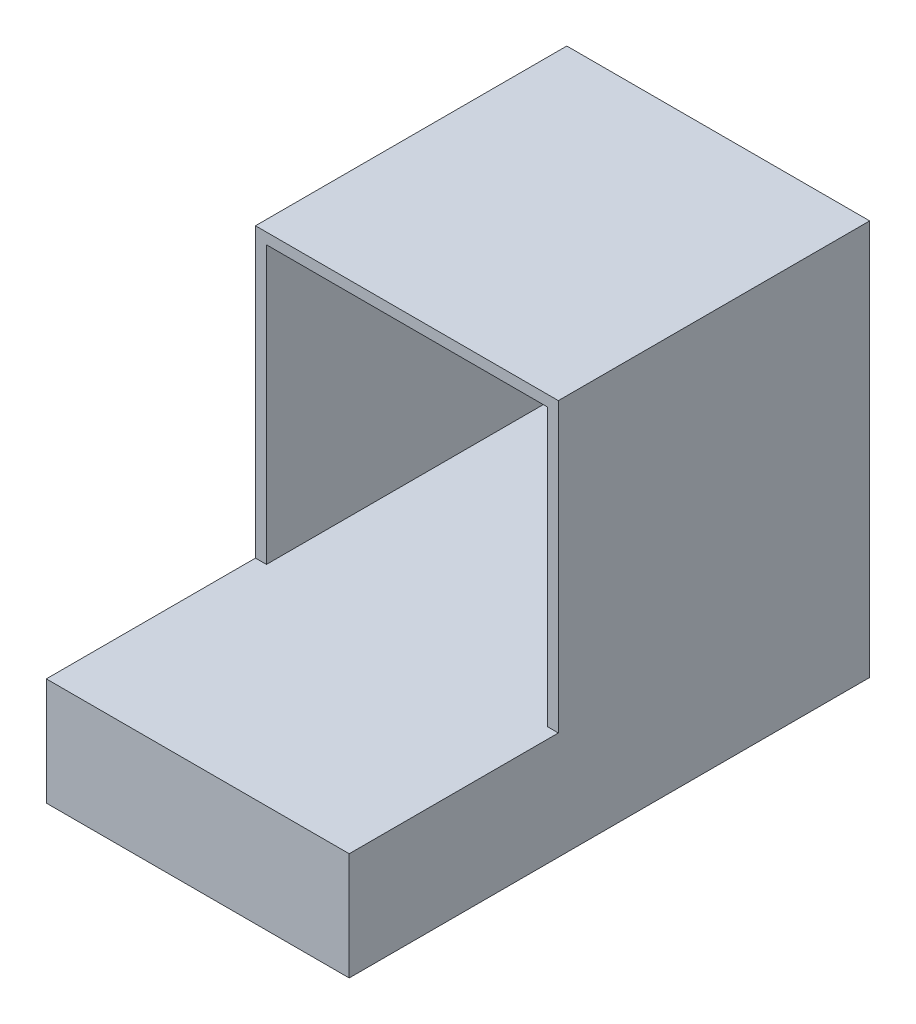
ISO-10303-21;
HEADER;
FILE_DESCRIPTION(('STEP AP214'),'2;1');
FILE_NAME('part.step','',(''),(''),'','','');
FILE_SCHEMA(('AUTOMOTIVE_DESIGN { 1 0 10303 214 1 1 1 1 }'));
ENDSEC;
DATA;
#1=APPLICATION_CONTEXT('core data for automotive mechanical design processes');
#2=APPLICATION_PROTOCOL_DEFINITION('international standard','automotive_design',2000,#1);
#3=PRODUCT_CONTEXT('',#1,'mechanical');
#4=PRODUCT('Part','Part','',(#3));
#5=PRODUCT_RELATED_PRODUCT_CATEGORY('part','',(#4));
#6=PRODUCT_DEFINITION_FORMATION('','',#4);
#7=PRODUCT_DEFINITION_CONTEXT('part definition',#1,'design');
#8=PRODUCT_DEFINITION('design','',#6,#7);
#9=PRODUCT_DEFINITION_SHAPE('','',#8);
#10=(LENGTH_UNIT() NAMED_UNIT(*) SI_UNIT(.MILLI.,.METRE.));
#11=(NAMED_UNIT(*) PLANE_ANGLE_UNIT() SI_UNIT($,.RADIAN.));
#12=(NAMED_UNIT(*) SI_UNIT($,.STERADIAN.) SOLID_ANGLE_UNIT());
#13=UNCERTAINTY_MEASURE_WITH_UNIT(LENGTH_MEASURE(1.E-05),#10,'distance_accuracy_value','');
#14=(GEOMETRIC_REPRESENTATION_CONTEXT(3) GLOBAL_UNCERTAINTY_ASSIGNED_CONTEXT((#13)) GLOBAL_UNIT_ASSIGNED_CONTEXT((#10,
#11,#12)) REPRESENTATION_CONTEXT('',''));
#15=CARTESIAN_POINT('',(0.,0.,0.));
#16=DIRECTION('',(0.,0.,1.));
#17=DIRECTION('',(1.,0.,0.));
#18=AXIS2_PLACEMENT_3D('',#15,#16,#17);
#19=CARTESIAN_POINT('',(4.7625,0.,134.9756));
#20=DIRECTION('',(1.,0.,0.));
#21=DIRECTION('',(0.,1.,0.));
#22=AXIS2_PLACEMENT_3D('',#19,#20,#21);
#23=PLANE('',#22);
#24=DIRECTION('',(0.,-1.,0.));
#25=VECTOR('',#24,1.);
#26=CARTESIAN_POINT('',(4.7625,0.,0.));
#27=LINE('',#26,#25);
#28=CARTESIAN_POINT('',(4.76250000000001,41.8973,0.));
#29=VERTEX_POINT('',#28);
#30=CARTESIAN_POINT('',(4.7625,4.7625,0.));
#31=VERTEX_POINT('',#30);
#32=EDGE_CURVE('E172',#29,#31,#27,.T.);
#33=ORIENTED_EDGE('',*,*,#32,.F.);
#34=DIRECTION('',(0.,0.,-1.));
#35=VECTOR('',#34,1.);
#36=CARTESIAN_POINT('',(4.76250000000001,41.8973,134.9756));
#37=LINE('',#36,#35);
#38=CARTESIAN_POINT('',(4.76250000000001,41.8973,220.8911));
#39=VERTEX_POINT('',#38);
#40=EDGE_CURVE('E48',#39,#29,#37,.T.);
#41=ORIENTED_EDGE('',*,*,#40,.F.);
#42=DIRECTION('',(0.,-1.,0.));
#43=VECTOR('',#42,1.);
#44=CARTESIAN_POINT('',(4.7625,0.,220.8911));
#45=LINE('',#44,#43);
#46=CARTESIAN_POINT('',(4.7625,4.7625,220.8911));
#47=VERTEX_POINT('',#46);
#48=EDGE_CURVE('E154',#39,#47,#45,.T.);
#49=ORIENTED_EDGE('',*,*,#48,.T.);
#50=DIRECTION('',(0.,0.,-1.));
#51=VECTOR('',#50,1.);
#52=CARTESIAN_POINT('',(4.7625,4.7625,134.9756));
#53=LINE('',#52,#51);
#54=EDGE_CURVE('E137',#47,#31,#53,.T.);
#55=ORIENTED_EDGE('',*,*,#54,.T.);
#56=EDGE_LOOP('',(#33,#41,#49,#55));
#57=FACE_BOUND('',#56,.T.);
#58=ADVANCED_FACE('F33',(#57),#23,.T.);
#59=CARTESIAN_POINT('',(126.5555,0.,134.9756));
#60=DIRECTION('',(-1.,0.,0.));
#61=DIRECTION('',(0.,0.,1.));
#62=AXIS2_PLACEMENT_3D('',#59,#60,#61);
#63=PLANE('',#62);
#64=DIRECTION('',(0.,0.,-1.));
#65=VECTOR('',#64,1.);
#66=CARTESIAN_POINT('',(126.5555,41.8973,225.6536));
#67=LINE('',#66,#65);
#68=CARTESIAN_POINT('',(126.5555,41.8973,220.8911));
#69=VERTEX_POINT('',#68);
#70=CARTESIAN_POINT('',(126.5555,41.8973,0.));
#71=VERTEX_POINT('',#70);
#72=EDGE_CURVE('E162',#69,#71,#67,.T.);
#73=ORIENTED_EDGE('',*,*,#72,.T.);
#74=DIRECTION('',(0.,1.,0.));
#75=VECTOR('',#74,1.);
#76=CARTESIAN_POINT('',(126.5555,0.,0.));
#77=LINE('',#76,#75);
#78=CARTESIAN_POINT('',(126.5555,4.7625,0.));
#79=VERTEX_POINT('',#78);
#80=EDGE_CURVE('E181',#79,#71,#77,.T.);
#81=ORIENTED_EDGE('',*,*,#80,.F.);
#82=DIRECTION('',(0.,0.,-1.));
#83=VECTOR('',#82,1.);
#84=CARTESIAN_POINT('',(126.5555,4.7625,134.9756));
#85=LINE('',#84,#83);
#86=CARTESIAN_POINT('',(126.5555,4.7625,220.8911));
#87=VERTEX_POINT('',#86);
#88=EDGE_CURVE('E148',#87,#79,#85,.T.);
#89=ORIENTED_EDGE('',*,*,#88,.F.);
#90=DIRECTION('',(0.,1.,0.));
#91=VECTOR('',#90,1.);
#92=CARTESIAN_POINT('',(126.5555,0.,220.8911));
#93=LINE('',#92,#91);
#94=EDGE_CURVE('E155',#87,#69,#93,.T.);
#95=ORIENTED_EDGE('',*,*,#94,.T.);
#96=EDGE_LOOP('',(#73,#81,#89,#95));
#97=FACE_BOUND('',#96,.T.);
#98=ADVANCED_FACE('F277',(#97),#63,.T.);
#99=CARTESIAN_POINT('',(0.,0.,134.9756));
#100=DIRECTION('',(0.,0.,-1.));
#101=DIRECTION('',(-1.,0.,0.));
#102=AXIS2_PLACEMENT_3D('',#99,#100,#101);
#103=PLANE('',#102);
#104=DIRECTION('',(0.,1.,0.));
#105=VECTOR('',#104,1.);
#106=CARTESIAN_POINT('',(126.5555,0.,134.9756));
#107=LINE('',#106,#105);
#108=CARTESIAN_POINT('',(126.5555,46.6598,134.9756));
#109=VERTEX_POINT('',#108);
#110=CARTESIAN_POINT('',(126.5555,166.6875,134.9756));
#111=VERTEX_POINT('',#110);
#112=EDGE_CURVE('E41',#109,#111,#107,.T.);
#113=ORIENTED_EDGE('',*,*,#112,.F.);
#114=DIRECTION('',(-1.,0.,0.));
#115=VECTOR('',#114,1.);
#116=CARTESIAN_POINT('',(0.,46.6598,134.9756));
#117=LINE('',#116,#115);
#118=CARTESIAN_POINT('',(131.318,46.6598,134.9756));
#119=VERTEX_POINT('',#118);
#120=EDGE_CURVE('E195',#119,#109,#117,.T.);
#121=ORIENTED_EDGE('',*,*,#120,.F.);
#122=DIRECTION('',(0.,1.,0.));
#123=VECTOR('',#122,1.);
#124=CARTESIAN_POINT('',(131.318,0.,134.9756));
#125=LINE('',#124,#123);
#126=CARTESIAN_POINT('',(131.318,171.45,134.9756));
#127=VERTEX_POINT('',#126);
#128=EDGE_CURVE('E214',#119,#127,#125,.T.);
#129=ORIENTED_EDGE('',*,*,#128,.T.);
#130=DIRECTION('',(-1.,0.,0.));
#131=VECTOR('',#130,1.);
#132=CARTESIAN_POINT('',(0.,171.45,134.9756));
#133=LINE('',#132,#131);
#134=CARTESIAN_POINT('',(0.,171.45,134.9756));
#135=VERTEX_POINT('',#134);
#136=EDGE_CURVE('E217',#127,#135,#133,.T.);
#137=ORIENTED_EDGE('',*,*,#136,.T.);
#138=DIRECTION('',(0.,-1.,0.));
#139=VECTOR('',#138,1.);
#140=CARTESIAN_POINT('',(0.,0.,134.9756));
#141=LINE('',#140,#139);
#142=CARTESIAN_POINT('',(0.,46.6598,134.9756));
#143=VERTEX_POINT('',#142);
#144=EDGE_CURVE('E211',#135,#143,#141,.T.);
#145=ORIENTED_EDGE('',*,*,#144,.T.);
#146=CARTESIAN_POINT('',(4.76250000000001,46.6598,134.9756));
#147=VERTEX_POINT('',#146);
#148=EDGE_CURVE('E147',#147,#143,#117,.T.);
#149=ORIENTED_EDGE('',*,*,#148,.F.);
#150=DIRECTION('',(0.,-1.,0.));
#151=VECTOR('',#150,1.);
#152=CARTESIAN_POINT('',(4.7625,0.,134.9756));
#153=LINE('',#152,#151);
#154=CARTESIAN_POINT('',(4.76250000000003,166.6875,134.9756));
#155=VERTEX_POINT('',#154);
#156=EDGE_CURVE('E180',#155,#147,#153,.T.);
#157=ORIENTED_EDGE('',*,*,#156,.F.);
#158=DIRECTION('',(-1.,0.,0.));
#159=VECTOR('',#158,1.);
#160=CARTESIAN_POINT('',(0.,166.6875,134.9756));
#161=LINE('',#160,#159);
#162=EDGE_CURVE('E167',#111,#155,#161,.T.);
#163=ORIENTED_EDGE('',*,*,#162,.F.);
#164=EDGE_LOOP('',(#113,#121,#129,#137,#145,#149,#157,#163));
#165=FACE_BOUND('',#164,.T.);
#166=ADVANCED_FACE('F257',(#165),#103,.F.);
#167=CARTESIAN_POINT('',(0.,0.,0.));
#168=DIRECTION('',(0.,0.,-1.));
#169=DIRECTION('',(-1.,0.,0.));
#170=AXIS2_PLACEMENT_3D('',#167,#168,#169);
#171=PLANE('',#170);
#172=DIRECTION('',(-1.,0.,0.));
#173=VECTOR('',#172,1.);
#174=CARTESIAN_POINT('',(131.318,41.8973,0.));
#175=LINE('',#174,#173);
#176=EDGE_CURVE('E158',#71,#29,#175,.T.);
#177=ORIENTED_EDGE('',*,*,#176,.T.);
#178=ORIENTED_EDGE('',*,*,#32,.T.);
#179=DIRECTION('',(1.,0.,0.));
#180=VECTOR('',#179,1.);
#181=CARTESIAN_POINT('',(0.,4.7625,0.));
#182=LINE('',#181,#180);
#183=EDGE_CURVE('E144',#31,#79,#182,.T.);
#184=ORIENTED_EDGE('',*,*,#183,.T.);
#185=ORIENTED_EDGE('',*,*,#80,.T.);
#186=EDGE_LOOP('',(#177,#178,#184,#185));
#187=FACE_BOUND('',#186,.T.);
#188=CARTESIAN_POINT('',(4.76250000000003,166.6875,0.));
#189=VERTEX_POINT('',#188);
#190=CARTESIAN_POINT('',(4.76250000000001,46.6598,0.));
#191=VERTEX_POINT('',#190);
#192=EDGE_CURVE('E175',#189,#191,#27,.T.);
#193=ORIENTED_EDGE('',*,*,#192,.T.);
#194=DIRECTION('',(-1.,0.,0.));
#195=VECTOR('',#194,1.);
#196=CARTESIAN_POINT('',(131.318,46.6598,0.));
#197=LINE('',#196,#195);
#198=CARTESIAN_POINT('',(126.5555,46.6598,0.));
#199=VERTEX_POINT('',#198);
#200=EDGE_CURVE('E436',#199,#191,#197,.T.);
#201=ORIENTED_EDGE('',*,*,#200,.F.);
#202=CARTESIAN_POINT('',(126.5555,166.6875,0.));
#203=VERTEX_POINT('',#202);
#204=EDGE_CURVE('E184',#199,#203,#77,.T.);
#205=ORIENTED_EDGE('',*,*,#204,.T.);
#206=DIRECTION('',(-1.,0.,0.));
#207=VECTOR('',#206,1.);
#208=CARTESIAN_POINT('',(0.,166.6875,0.));
#209=LINE('',#208,#207);
#210=EDGE_CURVE('E177',#203,#189,#209,.T.);
#211=ORIENTED_EDGE('',*,*,#210,.T.);
#212=EDGE_LOOP('',(#193,#201,#205,#211));
#213=FACE_BOUND('',#212,.T.);
#214=DIRECTION('',(1.,0.,0.));
#215=VECTOR('',#214,1.);
#216=CARTESIAN_POINT('',(0.,0.,0.));
#217=LINE('',#216,#215);
#218=CARTESIAN_POINT('',(0.,0.,0.));
#219=VERTEX_POINT('',#218);
#220=CARTESIAN_POINT('',(131.318,0.,0.));
#221=VERTEX_POINT('',#220);
#222=EDGE_CURVE('E221',#219,#221,#217,.T.);
#223=ORIENTED_EDGE('',*,*,#222,.F.);
#224=DIRECTION('',(0.,-1.,0.));
#225=VECTOR('',#224,1.);
#226=CARTESIAN_POINT('',(0.,0.,0.));
#227=LINE('',#226,#225);
#228=CARTESIAN_POINT('',(0.,171.45,0.));
#229=VERTEX_POINT('',#228);
#230=EDGE_CURVE('E210',#229,#219,#227,.T.);
#231=ORIENTED_EDGE('',*,*,#230,.F.);
#232=DIRECTION('',(-1.,0.,0.));
#233=VECTOR('',#232,1.);
#234=CARTESIAN_POINT('',(0.,171.45,0.));
#235=LINE('',#234,#233);
#236=CARTESIAN_POINT('',(131.318,171.45,0.));
#237=VERTEX_POINT('',#236);
#238=EDGE_CURVE('E215',#237,#229,#235,.T.);
#239=ORIENTED_EDGE('',*,*,#238,.F.);
#240=DIRECTION('',(0.,1.,0.));
#241=VECTOR('',#240,1.);
#242=CARTESIAN_POINT('',(131.318,0.,0.));
#243=LINE('',#242,#241);
#244=EDGE_CURVE('E223',#221,#237,#243,.T.);
#245=ORIENTED_EDGE('',*,*,#244,.F.);
#246=EDGE_LOOP('',(#223,#231,#239,#245));
#247=FACE_BOUND('',#246,.T.);
#248=ADVANCED_FACE('F246',(#187,#213,#247),#171,.T.);
#249=CARTESIAN_POINT('',(0.,0.,134.9756));
#250=DIRECTION('',(1.,0.,0.));
#251=DIRECTION('',(0.,1.,0.));
#252=AXIS2_PLACEMENT_3D('',#249,#250,#251);
#253=PLANE('',#252);
#254=ORIENTED_EDGE('',*,*,#230,.T.);
#255=DIRECTION('',(0.,0.,-1.));
#256=VECTOR('',#255,1.);
#257=CARTESIAN_POINT('',(0.,0.,134.9756));
#258=LINE('',#257,#256);
#259=CARTESIAN_POINT('',(0.,0.,225.6536));
#260=VERTEX_POINT('',#259);
#261=EDGE_CURVE('E188',#260,#219,#258,.T.);
#262=ORIENTED_EDGE('',*,*,#261,.F.);
#263=DIRECTION('',(0.,-1.,0.));
#264=VECTOR('',#263,1.);
#265=CARTESIAN_POINT('',(0.,0.,225.6536));
#266=LINE('',#265,#264);
#267=CARTESIAN_POINT('',(0.,46.6598,225.6536));
#268=VERTEX_POINT('',#267);
#269=EDGE_CURVE('E191',#268,#260,#266,.T.);
#270=ORIENTED_EDGE('',*,*,#269,.F.);
#271=DIRECTION('',(0.,0.,-1.));
#272=VECTOR('',#271,1.);
#273=CARTESIAN_POINT('',(0.,46.6598,225.6536));
#274=LINE('',#273,#272);
#275=EDGE_CURVE('E202',#268,#143,#274,.T.);
#276=ORIENTED_EDGE('',*,*,#275,.T.);
#277=ORIENTED_EDGE('',*,*,#144,.F.);
#278=DIRECTION('',(0.,0.,-1.));
#279=VECTOR('',#278,1.);
#280=CARTESIAN_POINT('',(0.,171.45,134.9756));
#281=LINE('',#280,#279);
#282=EDGE_CURVE('E219',#135,#229,#281,.T.);
#283=ORIENTED_EDGE('',*,*,#282,.T.);
#284=EDGE_LOOP('',(#254,#262,#270,#276,#277,#283));
#285=FACE_BOUND('',#284,.T.);
#286=ADVANCED_FACE('F35',(#285),#253,.F.);
#287=CARTESIAN_POINT('',(0.,0.,134.9756));
#288=DIRECTION('',(0.,1.,0.));
#289=DIRECTION('',(0.,0.,1.));
#290=AXIS2_PLACEMENT_3D('',#287,#288,#289);
#291=PLANE('',#290);
#292=ORIENTED_EDGE('',*,*,#222,.T.);
#293=DIRECTION('',(0.,0.,-1.));
#294=VECTOR('',#293,1.);
#295=CARTESIAN_POINT('',(131.318,0.,134.9756));
#296=LINE('',#295,#294);
#297=CARTESIAN_POINT('',(131.318,0.,225.6536));
#298=VERTEX_POINT('',#297);
#299=EDGE_CURVE('E231',#298,#221,#296,.T.);
#300=ORIENTED_EDGE('',*,*,#299,.F.);
#301=DIRECTION('',(1.,0.,0.));
#302=VECTOR('',#301,1.);
#303=CARTESIAN_POINT('',(0.,0.,225.6536));
#304=LINE('',#303,#302);
#305=EDGE_CURVE('E194',#260,#298,#304,.T.);
#306=ORIENTED_EDGE('',*,*,#305,.F.);
#307=ORIENTED_EDGE('',*,*,#261,.T.);
#308=EDGE_LOOP('',(#292,#300,#306,#307));
#309=FACE_BOUND('',#308,.T.);
#310=ADVANCED_FACE('F236',(#309),#291,.F.);
#311=CARTESIAN_POINT('',(131.318,0.,134.9756));
#312=DIRECTION('',(-1.,0.,0.));
#313=DIRECTION('',(0.,0.,1.));
#314=AXIS2_PLACEMENT_3D('',#311,#312,#313);
#315=PLANE('',#314);
#316=ORIENTED_EDGE('',*,*,#128,.F.);
#317=DIRECTION('',(0.,0.,-1.));
#318=VECTOR('',#317,1.);
#319=CARTESIAN_POINT('',(131.318,46.6598,225.6536));
#320=LINE('',#319,#318);
#321=CARTESIAN_POINT('',(131.318,46.6598,225.6536));
#322=VERTEX_POINT('',#321);
#323=EDGE_CURVE('E207',#322,#119,#320,.T.);
#324=ORIENTED_EDGE('',*,*,#323,.F.);
#325=DIRECTION('',(0.,1.,0.));
#326=VECTOR('',#325,1.);
#327=CARTESIAN_POINT('',(131.318,0.,225.6536));
#328=LINE('',#327,#326);
#329=EDGE_CURVE('E198',#298,#322,#328,.T.);
#330=ORIENTED_EDGE('',*,*,#329,.F.);
#331=ORIENTED_EDGE('',*,*,#299,.T.);
#332=ORIENTED_EDGE('',*,*,#244,.T.);
#333=DIRECTION('',(0.,0.,-1.));
#334=VECTOR('',#333,1.);
#335=CARTESIAN_POINT('',(131.318,171.45,134.9756));
#336=LINE('',#335,#334);
#337=EDGE_CURVE('E228',#127,#237,#336,.T.);
#338=ORIENTED_EDGE('',*,*,#337,.F.);
#339=EDGE_LOOP('',(#316,#324,#330,#331,#332,#338));
#340=FACE_BOUND('',#339,.T.);
#341=ADVANCED_FACE('F250',(#340),#315,.F.);
#342=CARTESIAN_POINT('',(0.,171.45,134.9756));
#343=DIRECTION('',(0.,-1.,0.));
#344=DIRECTION('',(0.,0.,-1.));
#345=AXIS2_PLACEMENT_3D('',#342,#343,#344);
#346=PLANE('',#345);
#347=ORIENTED_EDGE('',*,*,#238,.T.);
#348=ORIENTED_EDGE('',*,*,#282,.F.);
#349=ORIENTED_EDGE('',*,*,#136,.F.);
#350=ORIENTED_EDGE('',*,*,#337,.T.);
#351=EDGE_LOOP('',(#347,#348,#349,#350));
#352=FACE_BOUND('',#351,.T.);
#353=ADVANCED_FACE('F254',(#352),#346,.F.);
#354=CARTESIAN_POINT('',(0.,46.6598,225.6536));
#355=DIRECTION('',(0.,-1.,0.));
#356=DIRECTION('',(0.,0.,-1.));
#357=AXIS2_PLACEMENT_3D('',#354,#355,#356);
#358=PLANE('',#357);
#359=ORIENTED_EDGE('',*,*,#120,.T.);
#360=DIRECTION('',(0.,0.,-1.));
#361=VECTOR('',#360,1.);
#362=CARTESIAN_POINT('',(126.5555,46.6598,134.9756));
#363=LINE('',#362,#361);
#364=EDGE_CURVE('E11',#109,#199,#363,.T.);
#365=ORIENTED_EDGE('',*,*,#364,.T.);
#366=ORIENTED_EDGE('',*,*,#200,.T.);
#367=DIRECTION('',(0.,0.,1.));
#368=VECTOR('',#367,1.);
#369=CARTESIAN_POINT('',(4.76250000000001,46.6598,134.9756));
#370=LINE('',#369,#368);
#371=EDGE_CURVE('E56',#191,#147,#370,.T.);
#372=ORIENTED_EDGE('',*,*,#371,.T.);
#373=ORIENTED_EDGE('',*,*,#148,.T.);
#374=ORIENTED_EDGE('',*,*,#275,.F.);
#375=DIRECTION('',(-1.,0.,0.));
#376=VECTOR('',#375,1.);
#377=CARTESIAN_POINT('',(0.,46.6598,225.6536));
#378=LINE('',#377,#376);
#379=EDGE_CURVE('E200',#322,#268,#378,.T.);
#380=ORIENTED_EDGE('',*,*,#379,.F.);
#381=ORIENTED_EDGE('',*,*,#323,.T.);
#382=EDGE_LOOP('',(#359,#365,#366,#372,#373,#374,#380,#381));
#383=FACE_BOUND('',#382,.T.);
#384=ADVANCED_FACE('F262',(#383),#358,.F.);
#385=CARTESIAN_POINT('',(0.,0.,225.6536));
#386=DIRECTION('',(0.,0.,-1.));
#387=DIRECTION('',(-1.,0.,0.));
#388=AXIS2_PLACEMENT_3D('',#385,#386,#387);
#389=PLANE('',#388);
#390=ORIENTED_EDGE('',*,*,#269,.T.);
#391=ORIENTED_EDGE('',*,*,#305,.T.);
#392=ORIENTED_EDGE('',*,*,#329,.T.);
#393=ORIENTED_EDGE('',*,*,#379,.T.);
#394=EDGE_LOOP('',(#390,#391,#392,#393));
#395=FACE_BOUND('',#394,.T.);
#396=ADVANCED_FACE('F265',(#395),#389,.F.);
#397=ORIENTED_EDGE('',*,*,#371,.F.);
#398=ORIENTED_EDGE('',*,*,#192,.F.);
#399=DIRECTION('',(0.,0.,-1.));
#400=VECTOR('',#399,1.);
#401=CARTESIAN_POINT('',(4.76250000000003,166.6875,134.9756));
#402=LINE('',#401,#400);
#403=EDGE_CURVE('E164',#155,#189,#402,.T.);
#404=ORIENTED_EDGE('',*,*,#403,.F.);
#405=ORIENTED_EDGE('',*,*,#156,.T.);
#406=EDGE_LOOP('',(#397,#398,#404,#405));
#407=FACE_BOUND('',#406,.T.);
#408=ADVANCED_FACE('F267',(#407),#23,.T.);
#409=CARTESIAN_POINT('',(0.,4.7625,134.9756));
#410=DIRECTION('',(0.,1.,0.));
#411=DIRECTION('',(0.,0.,1.));
#412=AXIS2_PLACEMENT_3D('',#409,#410,#411);
#413=PLANE('',#412);
#414=ORIENTED_EDGE('',*,*,#183,.F.);
#415=ORIENTED_EDGE('',*,*,#54,.F.);
#416=DIRECTION('',(1.,0.,0.));
#417=VECTOR('',#416,1.);
#418=CARTESIAN_POINT('',(0.,4.7625,220.8911));
#419=LINE('',#418,#417);
#420=EDGE_CURVE('E141',#47,#87,#419,.T.);
#421=ORIENTED_EDGE('',*,*,#420,.T.);
#422=ORIENTED_EDGE('',*,*,#88,.T.);
#423=EDGE_LOOP('',(#414,#415,#421,#422));
#424=FACE_BOUND('',#423,.T.);
#425=ADVANCED_FACE('F139',(#424),#413,.T.);
#426=ORIENTED_EDGE('',*,*,#364,.F.);
#427=ORIENTED_EDGE('',*,*,#112,.T.);
#428=DIRECTION('',(0.,0.,-1.));
#429=VECTOR('',#428,1.);
#430=CARTESIAN_POINT('',(126.5555,166.6875,134.9756));
#431=LINE('',#430,#429);
#432=EDGE_CURVE('E166',#111,#203,#431,.T.);
#433=ORIENTED_EDGE('',*,*,#432,.T.);
#434=ORIENTED_EDGE('',*,*,#204,.F.);
#435=EDGE_LOOP('',(#426,#427,#433,#434));
#436=FACE_BOUND('',#435,.T.);
#437=ADVANCED_FACE('F283',(#436),#63,.T.);
#438=CARTESIAN_POINT('',(0.,166.6875,134.9756));
#439=DIRECTION('',(0.,-1.,0.));
#440=DIRECTION('',(0.,0.,-1.));
#441=AXIS2_PLACEMENT_3D('',#438,#439,#440);
#442=PLANE('',#441);
#443=ORIENTED_EDGE('',*,*,#210,.F.);
#444=ORIENTED_EDGE('',*,*,#432,.F.);
#445=ORIENTED_EDGE('',*,*,#162,.T.);
#446=ORIENTED_EDGE('',*,*,#403,.T.);
#447=EDGE_LOOP('',(#443,#444,#445,#446));
#448=FACE_BOUND('',#447,.T.);
#449=ADVANCED_FACE('F288',(#448),#442,.T.);
#450=CARTESIAN_POINT('',(0.,41.8973,225.6536));
#451=DIRECTION('',(0.,-1.,0.));
#452=DIRECTION('',(0.,0.,-1.));
#453=AXIS2_PLACEMENT_3D('',#450,#451,#452);
#454=PLANE('',#453);
#455=ORIENTED_EDGE('',*,*,#40,.T.);
#456=ORIENTED_EDGE('',*,*,#176,.F.);
#457=ORIENTED_EDGE('',*,*,#72,.F.);
#458=DIRECTION('',(-1.,0.,0.));
#459=VECTOR('',#458,1.);
#460=CARTESIAN_POINT('',(0.,41.8973,220.8911));
#461=LINE('',#460,#459);
#462=EDGE_CURVE('E163',#69,#39,#461,.T.);
#463=ORIENTED_EDGE('',*,*,#462,.T.);
#464=EDGE_LOOP('',(#455,#456,#457,#463));
#465=FACE_BOUND('',#464,.T.);
#466=ADVANCED_FACE('F292',(#465),#454,.T.);
#467=CARTESIAN_POINT('',(0.,0.,220.8911));
#468=DIRECTION('',(0.,0.,-1.));
#469=DIRECTION('',(-1.,0.,0.));
#470=AXIS2_PLACEMENT_3D('',#467,#468,#469);
#471=PLANE('',#470);
#472=ORIENTED_EDGE('',*,*,#48,.F.);
#473=ORIENTED_EDGE('',*,*,#462,.F.);
#474=ORIENTED_EDGE('',*,*,#94,.F.);
#475=ORIENTED_EDGE('',*,*,#420,.F.);
#476=EDGE_LOOP('',(#472,#473,#474,#475));
#477=FACE_BOUND('',#476,.T.);
#478=ADVANCED_FACE('F152',(#477),#471,.T.);
#479=CLOSED_SHELL('',(#58,#98,#166,#248,#286,#310,#341,#353,#384,#396,#408,#425,#437,#449,#466,#478));
#480=MANIFOLD_SOLID_BREP('B2',#479);
#481=ADVANCED_BREP_SHAPE_REPRESENTATION('',(#18,#480),#14);
#482=SHAPE_DEFINITION_REPRESENTATION(#9,#481);
ENDSEC;
END-ISO-10303-21;
